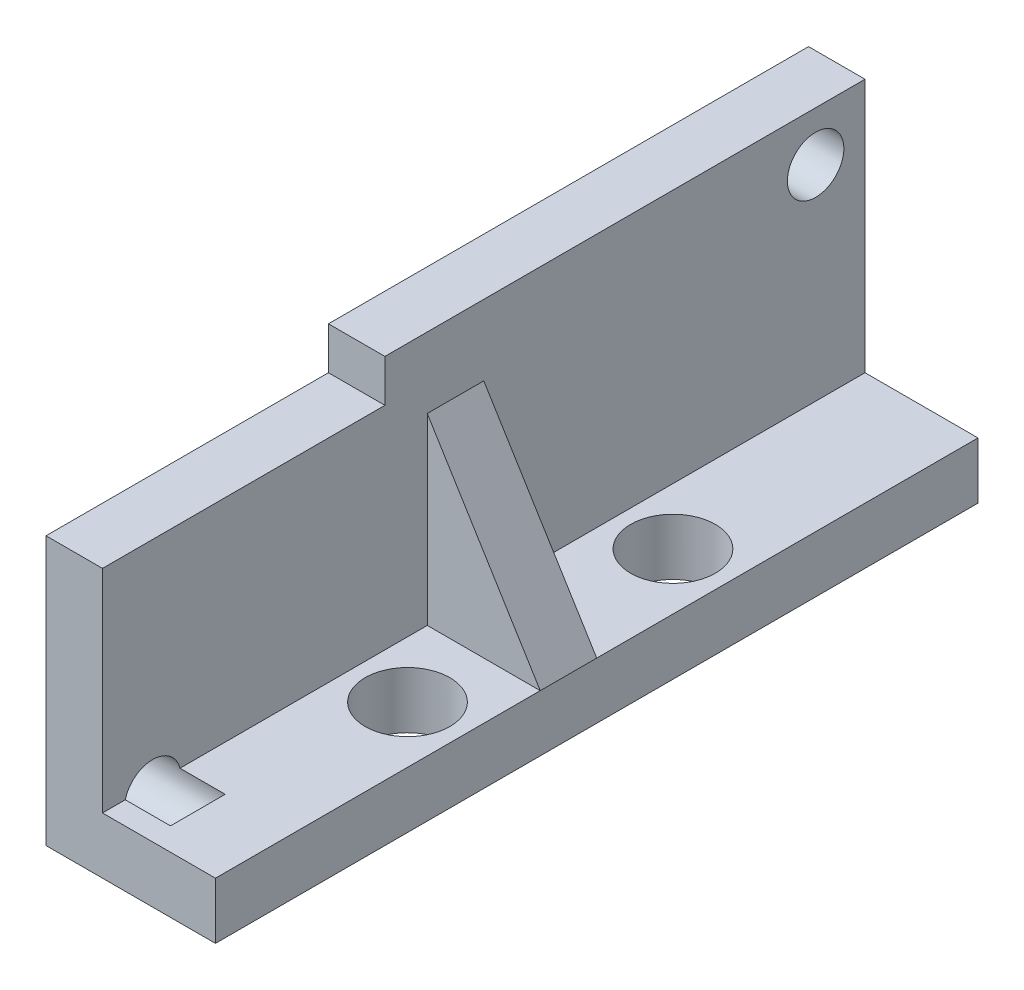
ISO-10303-21;
HEADER;
FILE_DESCRIPTION(('STEP AP214'),'2;1');
FILE_NAME('part.step','',(''),(''),'','','');
FILE_SCHEMA(('AUTOMOTIVE_DESIGN { 1 0 10303 214 1 1 1 1 }'));
ENDSEC;
DATA;
#1=APPLICATION_CONTEXT('core data for automotive mechanical design processes');
#2=APPLICATION_PROTOCOL_DEFINITION('international standard','automotive_design',2000,#1);
#3=PRODUCT_CONTEXT('',#1,'mechanical');
#4=PRODUCT('Part','Part','',(#3));
#5=PRODUCT_RELATED_PRODUCT_CATEGORY('part','',(#4));
#6=PRODUCT_DEFINITION_FORMATION('','',#4);
#7=PRODUCT_DEFINITION_CONTEXT('part definition',#1,'design');
#8=PRODUCT_DEFINITION('design','',#6,#7);
#9=PRODUCT_DEFINITION_SHAPE('','',#8);
#10=(LENGTH_UNIT() NAMED_UNIT(*) SI_UNIT(.MILLI.,.METRE.));
#11=(NAMED_UNIT(*) PLANE_ANGLE_UNIT() SI_UNIT($,.RADIAN.));
#12=(NAMED_UNIT(*) SI_UNIT($,.STERADIAN.) SOLID_ANGLE_UNIT());
#13=UNCERTAINTY_MEASURE_WITH_UNIT(LENGTH_MEASURE(1.E-05),#10,'distance_accuracy_value','');
#14=(GEOMETRIC_REPRESENTATION_CONTEXT(3) GLOBAL_UNCERTAINTY_ASSIGNED_CONTEXT((#13)) GLOBAL_UNIT_ASSIGNED_CONTEXT((#10,
#11,#12)) REPRESENTATION_CONTEXT('',''));
#15=CARTESIAN_POINT('',(0.,0.,0.));
#16=DIRECTION('',(0.,0.,1.));
#17=DIRECTION('',(1.,0.,0.));
#18=AXIS2_PLACEMENT_3D('',#15,#16,#17);
#19=CARTESIAN_POINT('',(6.,2.,13.5));
#20=DIRECTION('',(0.,-1.,0.));
#21=DIRECTION('',(1.,0.,0.));
#22=AXIS2_PLACEMENT_3D('',#19,#20,#21);
#23=PLANE('',#22);
#24=CARTESIAN_POINT('',(4.,2.,-4.7));
#25=DIRECTION('',(0.,1.,0.));
#26=DIRECTION('',(-1.,0.,0.));
#27=AXIS2_PLACEMENT_3D('',#24,#25,#26);
#28=CIRCLE('',#27,1.5);
#29=CARTESIAN_POINT('',(2.5,2.,-4.7));
#30=VERTEX_POINT('',#29);
#31=EDGE_CURVE('E300',#30,#30,#28,.T.);
#32=ORIENTED_EDGE('',*,*,#31,.F.);
#33=EDGE_LOOP('',(#32));
#34=FACE_BOUND('',#33,.T.);
#35=DIRECTION('',(1.,0.,0.));
#36=VECTOR('',#35,1.);
#37=CARTESIAN_POINT('',(6.,2.,0.));
#38=LINE('',#37,#36);
#39=CARTESIAN_POINT('',(2.,2.,0.));
#40=VERTEX_POINT('',#39);
#41=CARTESIAN_POINT('',(6.,2.,0.));
#42=VERTEX_POINT('',#41);
#43=EDGE_CURVE('E55',#40,#42,#38,.T.);
#44=ORIENTED_EDGE('',*,*,#43,.T.);
#45=DIRECTION('',(0.,0.,-1.));
#46=VECTOR('',#45,1.);
#47=CARTESIAN_POINT('',(6.,2.,13.5));
#48=LINE('',#47,#46);
#49=CARTESIAN_POINT('',(6.,2.,-13.5));
#50=VERTEX_POINT('',#49);
#51=EDGE_CURVE('E159',#42,#50,#48,.T.);
#52=ORIENTED_EDGE('',*,*,#51,.T.);
#53=DIRECTION('',(-1.,0.,0.));
#54=VECTOR('',#53,1.);
#55=CARTESIAN_POINT('',(6.,2.,-13.5));
#56=LINE('',#55,#54);
#57=CARTESIAN_POINT('',(2.,2.,-13.5));
#58=VERTEX_POINT('',#57);
#59=EDGE_CURVE('E240',#50,#58,#56,.T.);
#60=ORIENTED_EDGE('',*,*,#59,.T.);
#61=DIRECTION('',(0.,0.,-1.));
#62=VECTOR('',#61,1.);
#63=CARTESIAN_POINT('',(2.,2.,13.5));
#64=LINE('',#63,#62);
#65=EDGE_CURVE('E247',#40,#58,#64,.T.);
#66=ORIENTED_EDGE('',*,*,#65,.F.);
#67=EDGE_LOOP('',(#44,#52,#60,#66));
#68=FACE_BOUND('',#67,.T.);
#69=ADVANCED_FACE('F39',(#34,#68),#23,.F.);
#70=CARTESIAN_POINT('',(2.,11.,13.5));
#71=DIRECTION('',(0.,-1.,0.));
#72=DIRECTION('',(0.,0.,-1.));
#73=AXIS2_PLACEMENT_3D('',#70,#71,#72);
#74=PLANE('',#73);
#75=DIRECTION('',(0.,0.,-1.));
#76=VECTOR('',#75,1.);
#77=CARTESIAN_POINT('',(0.,11.,13.5));
#78=LINE('',#77,#76);
#79=CARTESIAN_POINT('',(0.,11.,3.5));
#80=VERTEX_POINT('',#79);
#81=CARTESIAN_POINT('',(0.,11.,-13.5));
#82=VERTEX_POINT('',#81);
#83=EDGE_CURVE('E170',#80,#82,#78,.T.);
#84=ORIENTED_EDGE('',*,*,#83,.F.);
#85=DIRECTION('',(1.,0.,0.));
#86=VECTOR('',#85,1.);
#87=CARTESIAN_POINT('',(-25.,11.,3.5));
#88=LINE('',#87,#86);
#89=CARTESIAN_POINT('',(2.,11.,3.5));
#90=VERTEX_POINT('',#89);
#91=EDGE_CURVE('E202',#80,#90,#88,.T.);
#92=ORIENTED_EDGE('',*,*,#91,.T.);
#93=DIRECTION('',(0.,0.,-1.));
#94=VECTOR('',#93,1.);
#95=CARTESIAN_POINT('',(2.,11.,13.5));
#96=LINE('',#95,#94);
#97=CARTESIAN_POINT('',(2.,11.,-13.5));
#98=VERTEX_POINT('',#97);
#99=EDGE_CURVE('E224',#90,#98,#96,.T.);
#100=ORIENTED_EDGE('',*,*,#99,.T.);
#101=DIRECTION('',(-1.,0.,0.));
#102=VECTOR('',#101,1.);
#103=CARTESIAN_POINT('',(2.,11.,-13.5));
#104=LINE('',#103,#102);
#105=EDGE_CURVE('E216',#98,#82,#104,.T.);
#106=ORIENTED_EDGE('',*,*,#105,.T.);
#107=EDGE_LOOP('',(#84,#92,#100,#106));
#108=FACE_BOUND('',#107,.T.);
#109=ADVANCED_FACE('F41',(#108),#74,.F.);
#110=CARTESIAN_POINT('',(0.,11.,13.5));
#111=DIRECTION('',(1.,0.,0.));
#112=DIRECTION('',(0.,1.,0.));
#113=AXIS2_PLACEMENT_3D('',#110,#111,#112);
#114=PLANE('',#113);
#115=CARTESIAN_POINT('',(0.,9.24999999999999,-11.75));
#116=DIRECTION('',(-1.,0.,0.));
#117=DIRECTION('',(0.,-1.,0.));
#118=AXIS2_PLACEMENT_3D('',#115,#116,#117);
#119=CIRCLE('',#118,0.999999999999999);
#120=CARTESIAN_POINT('',(0.,8.24999999999999,-11.75));
#121=VERTEX_POINT('',#120);
#122=EDGE_CURVE('E195',#121,#121,#119,.T.);
#123=ORIENTED_EDGE('',*,*,#122,.F.);
#124=EDGE_LOOP('',(#123));
#125=FACE_BOUND('',#124,.T.);
#126=CARTESIAN_POINT('',(0.,1.75,11.7237776687708));
#127=DIRECTION('',(-1.,0.,0.));
#128=DIRECTION('',(0.,-1.,0.));
#129=AXIS2_PLACEMENT_3D('',#126,#127,#128);
#130=CIRCLE('',#129,1.);
#131=CARTESIAN_POINT('',(0.,0.749999999999998,11.7237776687708));
#132=VERTEX_POINT('',#131);
#133=EDGE_CURVE('E315',#132,#132,#130,.T.);
#134=ORIENTED_EDGE('',*,*,#133,.F.);
#135=EDGE_LOOP('',(#134));
#136=FACE_BOUND('',#135,.T.);
#137=DIRECTION('',(0.,0.,-1.));
#138=VECTOR('',#137,1.);
#139=CARTESIAN_POINT('',(0.,0.,13.5));
#140=LINE('',#139,#138);
#141=CARTESIAN_POINT('',(0.,0.,13.5));
#142=VERTEX_POINT('',#141);
#143=CARTESIAN_POINT('',(0.,0.,-13.5));
#144=VERTEX_POINT('',#143);
#145=EDGE_CURVE('E163',#142,#144,#140,.T.);
#146=ORIENTED_EDGE('',*,*,#145,.F.);
#147=DIRECTION('',(0.,-1.,0.));
#148=VECTOR('',#147,1.);
#149=CARTESIAN_POINT('',(0.,11.,13.5));
#150=LINE('',#149,#148);
#151=CARTESIAN_POINT('',(0.,9.5,13.5));
#152=VERTEX_POINT('',#151);
#153=EDGE_CURVE('E217',#152,#142,#150,.T.);
#154=ORIENTED_EDGE('',*,*,#153,.F.);
#155=DIRECTION('',(0.,0.,-1.));
#156=VECTOR('',#155,1.);
#157=CARTESIAN_POINT('',(0.,9.5,13.5));
#158=LINE('',#157,#156);
#159=CARTESIAN_POINT('',(0.,9.5,3.5));
#160=VERTEX_POINT('',#159);
#161=EDGE_CURVE('E206',#152,#160,#158,.T.);
#162=ORIENTED_EDGE('',*,*,#161,.T.);
#163=DIRECTION('',(0.,1.,0.));
#164=VECTOR('',#163,1.);
#165=CARTESIAN_POINT('',(0.,11.,3.5));
#166=LINE('',#165,#164);
#167=EDGE_CURVE('E212',#160,#80,#166,.T.);
#168=ORIENTED_EDGE('',*,*,#167,.T.);
#169=ORIENTED_EDGE('',*,*,#83,.T.);
#170=DIRECTION('',(0.,-1.,0.));
#171=VECTOR('',#170,1.);
#172=CARTESIAN_POINT('',(0.,11.,-13.5));
#173=LINE('',#172,#171);
#174=EDGE_CURVE('E228',#82,#144,#173,.T.);
#175=ORIENTED_EDGE('',*,*,#174,.T.);
#176=EDGE_LOOP('',(#146,#154,#162,#168,#169,#175));
#177=FACE_BOUND('',#176,.T.);
#178=ADVANCED_FACE('F265',(#125,#136,#177),#114,.F.);
#179=CARTESIAN_POINT('',(0.,0.,13.5));
#180=DIRECTION('',(0.,1.,0.));
#181=DIRECTION('',(0.,0.,1.));
#182=AXIS2_PLACEMENT_3D('',#179,#180,#181);
#183=PLANE('',#182);
#184=CARTESIAN_POINT('',(4.,0.,-4.7));
#185=DIRECTION('',(0.,1.,0.));
#186=DIRECTION('',(0.,0.,1.));
#187=AXIS2_PLACEMENT_3D('',#184,#185,#186);
#188=CIRCLE('',#187,1.5);
#189=CARTESIAN_POINT('',(4.,0.,-3.2));
#190=VERTEX_POINT('',#189);
#191=EDGE_CURVE('E311',#190,#190,#188,.T.);
#192=ORIENTED_EDGE('',*,*,#191,.T.);
#193=EDGE_LOOP('',(#192));
#194=FACE_BOUND('',#193,.T.);
#195=CARTESIAN_POINT('',(4.,0.,4.7));
#196=DIRECTION('',(0.,1.,0.));
#197=DIRECTION('',(0.,0.,1.));
#198=AXIS2_PLACEMENT_3D('',#195,#196,#197);
#199=CIRCLE('',#198,1.5);
#200=CARTESIAN_POINT('',(4.,0.,6.2));
#201=VERTEX_POINT('',#200);
#202=EDGE_CURVE('E304',#201,#201,#199,.T.);
#203=ORIENTED_EDGE('',*,*,#202,.T.);
#204=EDGE_LOOP('',(#203));
#205=FACE_BOUND('',#204,.T.);
#206=DIRECTION('',(0.,0.,-1.));
#207=VECTOR('',#206,1.);
#208=CARTESIAN_POINT('',(6.,0.,13.5));
#209=LINE('',#208,#207);
#210=CARTESIAN_POINT('',(6.,0.,13.5));
#211=VERTEX_POINT('',#210);
#212=CARTESIAN_POINT('',(6.,0.,-13.5));
#213=VERTEX_POINT('',#212);
#214=EDGE_CURVE('E158',#211,#213,#209,.T.);
#215=ORIENTED_EDGE('',*,*,#214,.F.);
#216=DIRECTION('',(-1.,0.,0.));
#217=VECTOR('',#216,1.);
#218=CARTESIAN_POINT('',(0.,0.,13.5));
#219=LINE('',#218,#217);
#220=EDGE_CURVE('E141',#211,#142,#219,.T.);
#221=ORIENTED_EDGE('',*,*,#220,.T.);
#222=ORIENTED_EDGE('',*,*,#145,.T.);
#223=DIRECTION('',(1.,0.,0.));
#224=VECTOR('',#223,1.);
#225=CARTESIAN_POINT('',(0.,0.,-13.5));
#226=LINE('',#225,#224);
#227=EDGE_CURVE('E232',#144,#213,#226,.T.);
#228=ORIENTED_EDGE('',*,*,#227,.T.);
#229=EDGE_LOOP('',(#215,#221,#222,#228));
#230=FACE_BOUND('',#229,.T.);
#231=ADVANCED_FACE('F269',(#194,#205,#230),#183,.F.);
#232=CARTESIAN_POINT('',(6.,0.,13.5));
#233=DIRECTION('',(-1.,0.,0.));
#234=DIRECTION('',(0.,0.,1.));
#235=AXIS2_PLACEMENT_3D('',#232,#233,#234);
#236=PLANE('',#235);
#237=CARTESIAN_POINT('',(6.,2.,13.5));
#238=VERTEX_POINT('',#237);
#239=CARTESIAN_POINT('',(6.,2.,2.));
#240=VERTEX_POINT('',#239);
#241=EDGE_CURVE('E63',#238,#240,#48,.T.);
#242=ORIENTED_EDGE('',*,*,#241,.F.);
#243=DIRECTION('',(0.,1.,0.));
#244=VECTOR('',#243,1.);
#245=CARTESIAN_POINT('',(6.,-8.,13.5));
#246=LINE('',#245,#244);
#247=EDGE_CURVE('E135',#211,#238,#246,.T.);
#248=ORIENTED_EDGE('',*,*,#247,.F.);
#249=ORIENTED_EDGE('',*,*,#214,.T.);
#250=DIRECTION('',(0.,1.,0.));
#251=VECTOR('',#250,1.);
#252=CARTESIAN_POINT('',(6.,0.,-13.5));
#253=LINE('',#252,#251);
#254=EDGE_CURVE('E236',#213,#50,#253,.T.);
#255=ORIENTED_EDGE('',*,*,#254,.T.);
#256=ORIENTED_EDGE('',*,*,#51,.F.);
#257=DIRECTION('',(0.,0.,-1.));
#258=VECTOR('',#257,1.);
#259=CARTESIAN_POINT('',(6.,2.,2.));
#260=LINE('',#259,#258);
#261=EDGE_CURVE('E155',#240,#42,#260,.T.);
#262=ORIENTED_EDGE('',*,*,#261,.F.);
#263=EDGE_LOOP('',(#242,#248,#249,#255,#256,#262));
#264=FACE_BOUND('',#263,.T.);
#265=ADVANCED_FACE('F153',(#264),#236,.F.);
#266=CARTESIAN_POINT('',(4.,2.,4.7));
#267=DIRECTION('',(0.,1.,0.));
#268=DIRECTION('',(1.,0.,0.));
#269=AXIS2_PLACEMENT_3D('',#266,#267,#268);
#270=CIRCLE('',#269,1.5);
#271=CARTESIAN_POINT('',(5.5,2.,4.7));
#272=VERTEX_POINT('',#271);
#273=EDGE_CURVE('E299',#272,#272,#270,.T.);
#274=ORIENTED_EDGE('',*,*,#273,.F.);
#275=EDGE_LOOP('',(#274));
#276=FACE_BOUND('',#275,.T.);
#277=CARTESIAN_POINT('',(2.,2.,13.5));
#278=VERTEX_POINT('',#277);
#279=CARTESIAN_POINT('',(2.,2.,12.6920235053227));
#280=VERTEX_POINT('',#279);
#281=EDGE_CURVE('E149',#278,#280,#64,.T.);
#282=ORIENTED_EDGE('',*,*,#281,.F.);
#283=DIRECTION('',(-1.,0.,0.));
#284=VECTOR('',#283,1.);
#285=CARTESIAN_POINT('',(0.,2.,13.5));
#286=LINE('',#285,#284);
#287=EDGE_CURVE('E138',#238,#278,#286,.T.);
#288=ORIENTED_EDGE('',*,*,#287,.F.);
#289=ORIENTED_EDGE('',*,*,#241,.T.);
#290=DIRECTION('',(1.,0.,0.));
#291=VECTOR('',#290,1.);
#292=CARTESIAN_POINT('',(6.,2.,2.));
#293=LINE('',#292,#291);
#294=CARTESIAN_POINT('',(2.,2.,2.));
#295=VERTEX_POINT('',#294);
#296=EDGE_CURVE('E281',#295,#240,#293,.T.);
#297=ORIENTED_EDGE('',*,*,#296,.F.);
#298=CARTESIAN_POINT('',(2.,2.,10.7555318322189));
#299=VERTEX_POINT('',#298);
#300=EDGE_CURVE('E251',#299,#295,#64,.T.);
#301=ORIENTED_EDGE('',*,*,#300,.F.);
#302=DIRECTION('',(-1.,0.,0.));
#303=VECTOR('',#302,1.);
#304=CARTESIAN_POINT('',(3.6,2.,10.7555318322189));
#305=LINE('',#304,#303);
#306=CARTESIAN_POINT('',(3.6,2.,10.7555318322189));
#307=VERTEX_POINT('',#306);
#308=EDGE_CURVE('E190',#299,#307,#305,.F.);
#309=ORIENTED_EDGE('',*,*,#308,.T.);
#310=DIRECTION('',(0.,0.,-1.));
#311=VECTOR('',#310,1.);
#312=CARTESIAN_POINT('',(3.6,2.,13.5));
#313=LINE('',#312,#311);
#314=CARTESIAN_POINT('',(3.6,2.,12.6920235053227));
#315=VERTEX_POINT('',#314);
#316=EDGE_CURVE('E11',#315,#307,#313,.T.);
#317=ORIENTED_EDGE('',*,*,#316,.F.);
#318=DIRECTION('',(-1.,0.,0.));
#319=VECTOR('',#318,1.);
#320=CARTESIAN_POINT('',(3.6,2.,12.6920235053227));
#321=LINE('',#320,#319);
#322=EDGE_CURVE('E182',#315,#280,#321,.T.);
#323=ORIENTED_EDGE('',*,*,#322,.T.);
#324=EDGE_LOOP('',(#282,#288,#289,#297,#301,#309,#317,#323));
#325=FACE_BOUND('',#324,.T.);
#326=ADVANCED_FACE('F146',(#276,#325),#23,.F.);
#327=CARTESIAN_POINT('',(2.,2.,13.5));
#328=DIRECTION('',(-1.,0.,0.));
#329=DIRECTION('',(0.,0.,1.));
#330=AXIS2_PLACEMENT_3D('',#327,#328,#329);
#331=PLANE('',#330);
#332=CARTESIAN_POINT('',(2.,9.24999999999999,-11.75));
#333=DIRECTION('',(-1.,0.,0.));
#334=DIRECTION('',(0.,0.,1.));
#335=AXIS2_PLACEMENT_3D('',#332,#333,#334);
#336=CIRCLE('',#335,0.999999999999999);
#337=CARTESIAN_POINT('',(2.,9.24999999999999,-10.75));
#338=VERTEX_POINT('',#337);
#339=EDGE_CURVE('E178',#338,#338,#336,.T.);
#340=ORIENTED_EDGE('',*,*,#339,.T.);
#341=EDGE_LOOP('',(#340));
#342=FACE_BOUND('',#341,.T.);
#343=ORIENTED_EDGE('',*,*,#300,.T.);
#344=DIRECTION('',(0.,-1.,0.));
#345=VECTOR('',#344,1.);
#346=CARTESIAN_POINT('',(2.,2.,2.));
#347=LINE('',#346,#345);
#348=CARTESIAN_POINT('',(2.,8.5,2.));
#349=VERTEX_POINT('',#348);
#350=EDGE_CURVE('E277',#349,#295,#347,.T.);
#351=ORIENTED_EDGE('',*,*,#350,.F.);
#352=DIRECTION('',(0.,0.,-1.));
#353=VECTOR('',#352,1.);
#354=CARTESIAN_POINT('',(2.,8.5,2.));
#355=LINE('',#354,#353);
#356=CARTESIAN_POINT('',(2.,8.5,0.));
#357=VERTEX_POINT('',#356);
#358=EDGE_CURVE('E288',#349,#357,#355,.T.);
#359=ORIENTED_EDGE('',*,*,#358,.T.);
#360=DIRECTION('',(0.,-1.,0.));
#361=VECTOR('',#360,1.);
#362=CARTESIAN_POINT('',(2.,2.,0.));
#363=LINE('',#362,#361);
#364=EDGE_CURVE('E272',#357,#40,#363,.T.);
#365=ORIENTED_EDGE('',*,*,#364,.T.);
#366=ORIENTED_EDGE('',*,*,#65,.T.);
#367=DIRECTION('',(0.,1.,0.));
#368=VECTOR('',#367,1.);
#369=CARTESIAN_POINT('',(2.,2.,-13.5));
#370=LINE('',#369,#368);
#371=EDGE_CURVE('E221',#58,#98,#370,.T.);
#372=ORIENTED_EDGE('',*,*,#371,.T.);
#373=ORIENTED_EDGE('',*,*,#99,.F.);
#374=DIRECTION('',(0.,1.,0.));
#375=VECTOR('',#374,1.);
#376=CARTESIAN_POINT('',(2.,9.5,3.5));
#377=LINE('',#376,#375);
#378=CARTESIAN_POINT('',(2.,9.5,3.5));
#379=VERTEX_POINT('',#378);
#380=EDGE_CURVE('E188',#379,#90,#377,.T.);
#381=ORIENTED_EDGE('',*,*,#380,.F.);
#382=DIRECTION('',(0.,0.,-1.));
#383=VECTOR('',#382,1.);
#384=CARTESIAN_POINT('',(2.,9.5,13.5));
#385=LINE('',#384,#383);
#386=CARTESIAN_POINT('',(2.,9.5,13.5));
#387=VERTEX_POINT('',#386);
#388=EDGE_CURVE('E181',#387,#379,#385,.T.);
#389=ORIENTED_EDGE('',*,*,#388,.F.);
#390=DIRECTION('',(0.,1.,0.));
#391=VECTOR('',#390,1.);
#392=CARTESIAN_POINT('',(2.,2.,13.5));
#393=LINE('',#392,#391);
#394=EDGE_CURVE('E220',#278,#387,#393,.T.);
#395=ORIENTED_EDGE('',*,*,#394,.F.);
#396=ORIENTED_EDGE('',*,*,#281,.T.);
#397=CARTESIAN_POINT('',(2.,1.75,11.7237776687708));
#398=DIRECTION('',(-1.,0.,0.));
#399=DIRECTION('',(0.,0.,1.));
#400=AXIS2_PLACEMENT_3D('',#397,#398,#399);
#401=CIRCLE('',#400,1.);
#402=EDGE_CURVE('E48',#280,#299,#401,.T.);
#403=ORIENTED_EDGE('',*,*,#402,.T.);
#404=EDGE_LOOP('',(#343,#351,#359,#365,#366,#372,#373,#381,#389,#395,#396,#403));
#405=FACE_BOUND('',#404,.T.);
#406=ADVANCED_FACE('F256',(#342,#405),#331,.F.);
#407=CARTESIAN_POINT('',(0.,0.,13.5));
#408=DIRECTION('',(0.,0.,1.));
#409=DIRECTION('',(1.,0.,0.));
#410=AXIS2_PLACEMENT_3D('',#407,#408,#409);
#411=PLANE('',#410);
#412=ORIENTED_EDGE('',*,*,#153,.T.);
#413=ORIENTED_EDGE('',*,*,#220,.F.);
#414=ORIENTED_EDGE('',*,*,#247,.T.);
#415=ORIENTED_EDGE('',*,*,#287,.T.);
#416=ORIENTED_EDGE('',*,*,#394,.T.);
#417=DIRECTION('',(1.,0.,0.));
#418=VECTOR('',#417,1.);
#419=CARTESIAN_POINT('',(0.,9.5,13.5));
#420=LINE('',#419,#418);
#421=EDGE_CURVE('E173',#152,#387,#420,.T.);
#422=ORIENTED_EDGE('',*,*,#421,.F.);
#423=EDGE_LOOP('',(#412,#413,#414,#415,#416,#422));
#424=FACE_BOUND('',#423,.T.);
#425=ADVANCED_FACE('F136',(#424),#411,.T.);
#426=CARTESIAN_POINT('',(0.,0.,-13.5));
#427=DIRECTION('',(0.,0.,1.));
#428=DIRECTION('',(1.,0.,0.));
#429=AXIS2_PLACEMENT_3D('',#426,#427,#428);
#430=PLANE('',#429);
#431=ORIENTED_EDGE('',*,*,#105,.F.);
#432=ORIENTED_EDGE('',*,*,#371,.F.);
#433=ORIENTED_EDGE('',*,*,#59,.F.);
#434=ORIENTED_EDGE('',*,*,#254,.F.);
#435=ORIENTED_EDGE('',*,*,#227,.F.);
#436=ORIENTED_EDGE('',*,*,#174,.F.);
#437=EDGE_LOOP('',(#431,#432,#433,#434,#435,#436));
#438=FACE_BOUND('',#437,.T.);
#439=ADVANCED_FACE('F384',(#438),#430,.F.);
#440=CARTESIAN_POINT('',(-25.,9.5,3.5));
#441=DIRECTION('',(0.,0.,-1.));
#442=DIRECTION('',(-1.,0.,0.));
#443=AXIS2_PLACEMENT_3D('',#440,#441,#442);
#444=PLANE('',#443);
#445=DIRECTION('',(1.,0.,0.));
#446=VECTOR('',#445,1.);
#447=CARTESIAN_POINT('',(-25.,9.5,3.5));
#448=LINE('',#447,#446);
#449=EDGE_CURVE('E201',#160,#379,#448,.T.);
#450=ORIENTED_EDGE('',*,*,#449,.T.);
#451=ORIENTED_EDGE('',*,*,#380,.T.);
#452=ORIENTED_EDGE('',*,*,#91,.F.);
#453=ORIENTED_EDGE('',*,*,#167,.F.);
#454=EDGE_LOOP('',(#450,#451,#452,#453));
#455=FACE_BOUND('',#454,.T.);
#456=ADVANCED_FACE('F381',(#455),#444,.F.);
#457=CARTESIAN_POINT('',(-25.,9.5,13.5));
#458=DIRECTION('',(0.,-1.,0.));
#459=DIRECTION('',(1.,0.,0.));
#460=AXIS2_PLACEMENT_3D('',#457,#458,#459);
#461=PLANE('',#460);
#462=ORIENTED_EDGE('',*,*,#421,.T.);
#463=ORIENTED_EDGE('',*,*,#388,.T.);
#464=ORIENTED_EDGE('',*,*,#449,.F.);
#465=ORIENTED_EDGE('',*,*,#161,.F.);
#466=EDGE_LOOP('',(#462,#463,#464,#465));
#467=FACE_BOUND('',#466,.T.);
#468=ADVANCED_FACE('F377',(#467),#461,.F.);
#469=CARTESIAN_POINT('',(3.6,1.75,11.7237776687708));
#470=DIRECTION('',(-1.,0.,0.));
#471=DIRECTION('',(0.,-1.,0.));
#472=AXIS2_PLACEMENT_3D('',#469,#470,#471);
#473=PLANE('',#472);
#474=ORIENTED_EDGE('',*,*,#316,.T.);
#475=CARTESIAN_POINT('',(3.6,1.75,11.7237776687708));
#476=DIRECTION('',(-1.,0.,0.));
#477=DIRECTION('',(0.,-1.,0.));
#478=AXIS2_PLACEMENT_3D('',#475,#476,#477);
#479=CIRCLE('',#478,1.);
#480=EDGE_CURVE('E319',#307,#315,#479,.T.);
#481=ORIENTED_EDGE('',*,*,#480,.T.);
#482=EDGE_LOOP('',(#474,#481));
#483=FACE_BOUND('',#482,.T.);
#484=ADVANCED_FACE('F374',(#483),#473,.T.);
#485=CARTESIAN_POINT('',(3.6,1.75,11.7237776687708));
#486=DIRECTION('',(-1.,0.,0.));
#487=DIRECTION('',(0.,-1.,0.));
#488=AXIS2_PLACEMENT_3D('',#485,#486,#487);
#489=CYLINDRICAL_SURFACE('',#488,1.);
#490=ORIENTED_EDGE('',*,*,#133,.T.);
#491=EDGE_LOOP('',(#490));
#492=FACE_BOUND('',#491,.T.);
#493=ORIENTED_EDGE('',*,*,#480,.F.);
#494=ORIENTED_EDGE('',*,*,#308,.F.);
#495=ORIENTED_EDGE('',*,*,#402,.F.);
#496=ORIENTED_EDGE('',*,*,#322,.F.);
#497=EDGE_LOOP('',(#493,#494,#495,#496));
#498=FACE_BOUND('',#497,.T.);
#499=ADVANCED_FACE('F326',(#492,#498),#489,.F.);
#500=CARTESIAN_POINT('',(3.6,9.24999999999999,-11.75));
#501=DIRECTION('',(-1.,0.,0.));
#502=DIRECTION('',(0.,-1.,0.));
#503=AXIS2_PLACEMENT_3D('',#500,#501,#502);
#504=CYLINDRICAL_SURFACE('',#503,0.999999999999999);
#505=ORIENTED_EDGE('',*,*,#122,.T.);
#506=EDGE_LOOP('',(#505));
#507=FACE_BOUND('',#506,.T.);
#508=ORIENTED_EDGE('',*,*,#339,.F.);
#509=EDGE_LOOP('',(#508));
#510=FACE_BOUND('',#509,.T.);
#511=ADVANCED_FACE('F360',(#507,#510),#504,.F.);
#512=CARTESIAN_POINT('',(4.,-7.,4.7));
#513=DIRECTION('',(0.,1.,0.));
#514=DIRECTION('',(-1.,0.,0.));
#515=AXIS2_PLACEMENT_3D('',#512,#513,#514);
#516=CYLINDRICAL_SURFACE('',#515,1.5);
#517=ORIENTED_EDGE('',*,*,#273,.T.);
#518=EDGE_LOOP('',(#517));
#519=FACE_BOUND('',#518,.T.);
#520=ORIENTED_EDGE('',*,*,#202,.F.);
#521=EDGE_LOOP('',(#520));
#522=FACE_BOUND('',#521,.T.);
#523=ADVANCED_FACE('F356',(#519,#522),#516,.F.);
#524=CARTESIAN_POINT('',(4.,-7.,-4.7));
#525=DIRECTION('',(0.,1.,0.));
#526=DIRECTION('',(-1.,0.,0.));
#527=AXIS2_PLACEMENT_3D('',#524,#525,#526);
#528=CYLINDRICAL_SURFACE('',#527,1.5);
#529=ORIENTED_EDGE('',*,*,#31,.T.);
#530=EDGE_LOOP('',(#529));
#531=FACE_BOUND('',#530,.T.);
#532=ORIENTED_EDGE('',*,*,#191,.F.);
#533=EDGE_LOOP('',(#532));
#534=FACE_BOUND('',#533,.T.);
#535=ADVANCED_FACE('F359',(#531,#534),#528,.F.);
#536=CARTESIAN_POINT('',(2.,8.5,2.));
#537=DIRECTION('',(-0.851658316704544,-0.524097425664335,0.));
#538=DIRECTION('',(0.524097425664335,-0.851658316704544,0.));
#539=AXIS2_PLACEMENT_3D('',#536,#537,#538);
#540=PLANE('',#539);
#541=DIRECTION('',(-0.524097425664335,0.851658316704544,0.));
#542=VECTOR('',#541,1.);
#543=CARTESIAN_POINT('',(2.,8.5,0.));
#544=LINE('',#543,#542);
#545=EDGE_CURVE('E282',#42,#357,#544,.T.);
#546=ORIENTED_EDGE('',*,*,#545,.T.);
#547=ORIENTED_EDGE('',*,*,#358,.F.);
#548=DIRECTION('',(-0.524097425664335,0.851658316704544,0.));
#549=VECTOR('',#548,1.);
#550=CARTESIAN_POINT('',(2.,8.5,2.));
#551=LINE('',#550,#549);
#552=EDGE_CURVE('E285',#240,#349,#551,.T.);
#553=ORIENTED_EDGE('',*,*,#552,.F.);
#554=ORIENTED_EDGE('',*,*,#261,.T.);
#555=EDGE_LOOP('',(#546,#547,#553,#554));
#556=FACE_BOUND('',#555,.T.);
#557=ADVANCED_FACE('F367',(#556),#540,.F.);
#558=CARTESIAN_POINT('',(0.,0.,2.));
#559=DIRECTION('',(0.,0.,1.));
#560=DIRECTION('',(1.,0.,0.));
#561=AXIS2_PLACEMENT_3D('',#558,#559,#560);
#562=PLANE('',#561);
#563=ORIENTED_EDGE('',*,*,#350,.T.);
#564=ORIENTED_EDGE('',*,*,#296,.T.);
#565=ORIENTED_EDGE('',*,*,#552,.T.);
#566=EDGE_LOOP('',(#563,#564,#565));
#567=FACE_BOUND('',#566,.T.);
#568=ADVANCED_FACE('F407',(#567),#562,.T.);
#569=CARTESIAN_POINT('',(0.,0.,0.));
#570=DIRECTION('',(0.,0.,1.));
#571=DIRECTION('',(1.,0.,0.));
#572=AXIS2_PLACEMENT_3D('',#569,#570,#571);
#573=PLANE('',#572);
#574=ORIENTED_EDGE('',*,*,#364,.F.);
#575=ORIENTED_EDGE('',*,*,#545,.F.);
#576=ORIENTED_EDGE('',*,*,#43,.F.);
#577=EDGE_LOOP('',(#574,#575,#576));
#578=FACE_BOUND('',#577,.T.);
#579=ADVANCED_FACE('F405',(#578),#573,.F.);
#580=CLOSED_SHELL('',(#69,#109,#178,#231,#265,#326,#406,#425,#439,#456,#468,#484,#499,#511,#523,
#535,#557,#568,#579));
#581=MANIFOLD_SOLID_BREP('B2',#580);
#582=ADVANCED_BREP_SHAPE_REPRESENTATION('',(#18,#581),#14);
#583=SHAPE_DEFINITION_REPRESENTATION(#9,#582);
ENDSEC;
END-ISO-10303-21;
